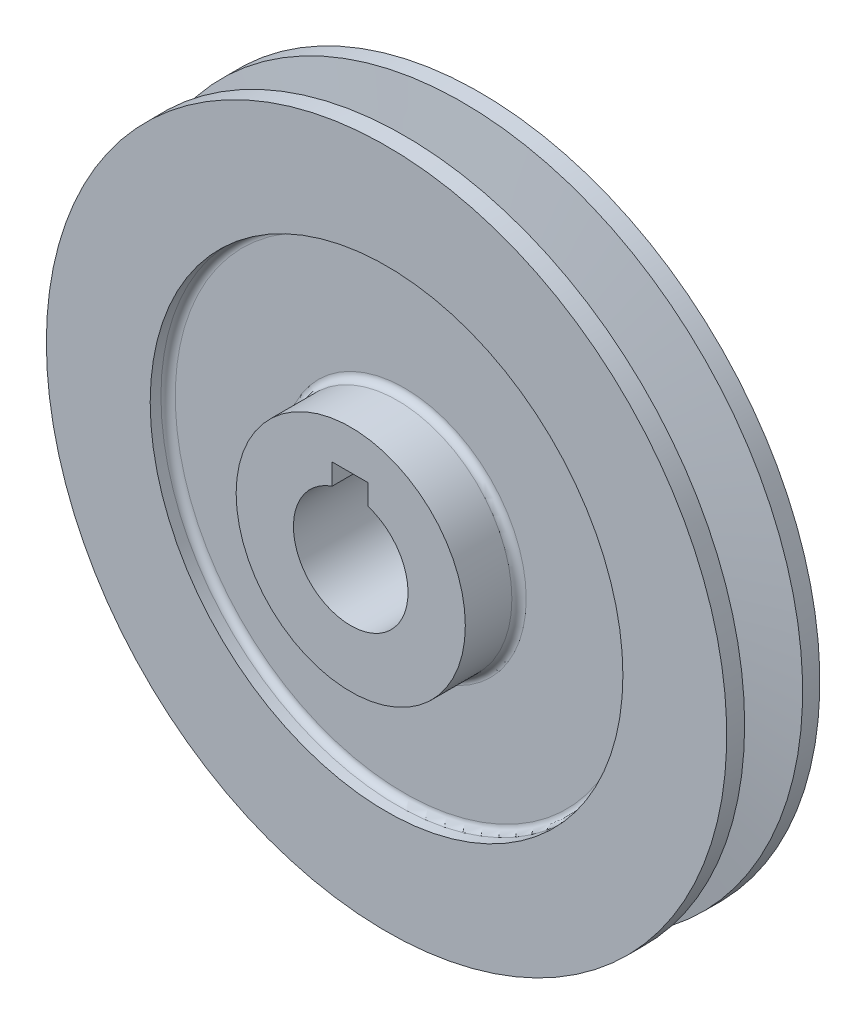
ISO-10303-21;
HEADER;
FILE_DESCRIPTION(('STEP AP214'),'2;1');
FILE_NAME('part.step','',(''),(''),'','','');
FILE_SCHEMA(('AUTOMOTIVE_DESIGN { 1 0 10303 214 1 1 1 1 }'));
ENDSEC;
DATA;
#1=APPLICATION_CONTEXT('core data for automotive mechanical design processes');
#2=APPLICATION_PROTOCOL_DEFINITION('international standard','automotive_design',2000,#1);
#3=PRODUCT_CONTEXT('',#1,'mechanical');
#4=PRODUCT('Part','Part','',(#3));
#5=PRODUCT_RELATED_PRODUCT_CATEGORY('part','',(#4));
#6=PRODUCT_DEFINITION_FORMATION('','',#4);
#7=PRODUCT_DEFINITION_CONTEXT('part definition',#1,'design');
#8=PRODUCT_DEFINITION('design','',#6,#7);
#9=PRODUCT_DEFINITION_SHAPE('','',#8);
#10=(LENGTH_UNIT() NAMED_UNIT(*) SI_UNIT(.MILLI.,.METRE.));
#11=(NAMED_UNIT(*) PLANE_ANGLE_UNIT() SI_UNIT($,.RADIAN.));
#12=(NAMED_UNIT(*) SI_UNIT($,.STERADIAN.) SOLID_ANGLE_UNIT());
#13=UNCERTAINTY_MEASURE_WITH_UNIT(LENGTH_MEASURE(1.E-05),#10,'distance_accuracy_value','');
#14=(GEOMETRIC_REPRESENTATION_CONTEXT(3) GLOBAL_UNCERTAINTY_ASSIGNED_CONTEXT((#13)) GLOBAL_UNIT_ASSIGNED_CONTEXT((#10,
#11,#12)) REPRESENTATION_CONTEXT('',''));
#15=CARTESIAN_POINT('',(0.,0.,0.));
#16=DIRECTION('',(0.,0.,1.));
#17=DIRECTION('',(1.,0.,0.));
#18=AXIS2_PLACEMENT_3D('',#15,#16,#17);
#19=CARTESIAN_POINT('',(0.,0.,13.));
#20=DIRECTION('',(0.,0.,-1.));
#21=DIRECTION('',(-1.,0.,0.));
#22=AXIS2_PLACEMENT_3D('',#19,#20,#21);
#23=CYLINDRICAL_SURFACE('',#22,47.5);
#24=CARTESIAN_POINT('',(0.,0.,0.));
#25=DIRECTION('',(0.,0.,1.));
#26=DIRECTION('',(1.,0.,0.));
#27=AXIS2_PLACEMENT_3D('',#24,#25,#26);
#28=CIRCLE('',#27,47.5);
#29=CARTESIAN_POINT('',(-47.5,0.,0.));
#30=VERTEX_POINT('',#29);
#31=EDGE_CURVE('E142',#30,#30,#28,.T.);
#32=CARTESIAN_POINT('',(0.,0.,2.40344567971953));
#33=DIRECTION('',(0.,0.,1.));
#34=DIRECTION('',(1.,0.,0.));
#35=AXIS2_PLACEMENT_3D('',#32,#33,#34);
#36=CIRCLE('',#35,47.5);
#37=CARTESIAN_POINT('',(-47.5,0.,2.40344567971953));
#38=VERTEX_POINT('',#37);
#39=EDGE_CURVE('E122',#38,#38,#36,.T.);
#40=CARTESIAN_POINT('',(-47.5,0.,0.));
#41=CARTESIAN_POINT('',(-47.5,0.,0.0250358924970782));
#42=CARTESIAN_POINT('',(-47.5,0.,0.0500717849941564));
#43=CARTESIAN_POINT('',(-47.5,0.,0.100143569988313));
#44=CARTESIAN_POINT('',(-47.5,0.,0.125179462485392));
#45=CARTESIAN_POINT('',(-47.5,0.,0.17525124747955));
#46=CARTESIAN_POINT('',(-47.5,0.,0.200287139976628));
#47=CARTESIAN_POINT('',(-47.5,0.,0.250358924970785));
#48=CARTESIAN_POINT('',(-47.5,0.,0.275394817467864));
#49=CARTESIAN_POINT('',(-47.5,0.,0.32546660246202));
#50=CARTESIAN_POINT('',(-47.5,0.,0.350502494959098));
#51=CARTESIAN_POINT('',(-47.5,0.,0.400574279953255));
#52=CARTESIAN_POINT('',(-47.5,0.,0.425610172450334));
#53=CARTESIAN_POINT('',(-47.5,0.,0.475681957444492));
#54=CARTESIAN_POINT('',(-47.5,0.,0.50071784994157));
#55=CARTESIAN_POINT('',(-47.5,0.,0.550789634935727));
#56=CARTESIAN_POINT('',(-47.5,0.,0.575825527432805));
#57=CARTESIAN_POINT('',(-47.5,0.,0.625897312426962));
#58=CARTESIAN_POINT('',(-47.5,0.,0.65093320492404));
#59=CARTESIAN_POINT('',(-47.5,0.,0.701004989918197));
#60=CARTESIAN_POINT('',(-47.5,0.,0.726040882415276));
#61=CARTESIAN_POINT('',(-47.5,0.,0.776112667409433));
#62=CARTESIAN_POINT('',(-47.5,0.,0.801148559906512));
#63=CARTESIAN_POINT('',(-47.5,0.,0.851220344900669));
#64=CARTESIAN_POINT('',(-47.5,0.,0.876256237397747));
#65=CARTESIAN_POINT('',(-47.5,0.,0.926328022391904));
#66=CARTESIAN_POINT('',(-47.5,0.,0.951363914888982));
#67=CARTESIAN_POINT('',(-47.5,0.,1.00143569988314));
#68=CARTESIAN_POINT('',(-47.5,0.,1.02647159238022));
#69=CARTESIAN_POINT('',(-47.5,0.,1.07654337737438));
#70=CARTESIAN_POINT('',(-47.5,0.,1.10157926987145));
#71=CARTESIAN_POINT('',(-47.5,0.,1.15165105486561));
#72=CARTESIAN_POINT('',(-47.5,0.,1.17668694736269));
#73=CARTESIAN_POINT('',(-47.5,0.,1.22675873235685));
#74=CARTESIAN_POINT('',(-47.5,0.,1.25179462485392));
#75=CARTESIAN_POINT('',(-47.5,0.,1.30186640984808));
#76=CARTESIAN_POINT('',(-47.5,0.,1.32690230234516));
#77=CARTESIAN_POINT('',(-47.5,0.,1.37697408733932));
#78=CARTESIAN_POINT('',(-47.5,0.,1.4020099798364));
#79=CARTESIAN_POINT('',(-47.5,0.,1.45208176483055));
#80=CARTESIAN_POINT('',(-47.5,0.,1.47711765732763));
#81=CARTESIAN_POINT('',(-47.5,0.,1.52718944232179));
#82=CARTESIAN_POINT('',(-47.5,0.,1.55222533481887));
#83=CARTESIAN_POINT('',(-47.5,0.,1.60229711981302));
#84=CARTESIAN_POINT('',(-47.5,0.,1.6273330123101));
#85=CARTESIAN_POINT('',(-47.5,0.,1.67740479730426));
#86=CARTESIAN_POINT('',(-47.5,0.,1.70244068980134));
#87=CARTESIAN_POINT('',(-47.5,0.,1.75251247479549));
#88=CARTESIAN_POINT('',(-47.5,0.,1.77754836729257));
#89=CARTESIAN_POINT('',(-47.5,0.,1.82762015228673));
#90=CARTESIAN_POINT('',(-47.5,0.,1.85265604478381));
#91=CARTESIAN_POINT('',(-47.5,0.,1.90272782977796));
#92=CARTESIAN_POINT('',(-47.5,0.,1.92776372227504));
#93=CARTESIAN_POINT('',(-47.5,0.,1.9778355072692));
#94=CARTESIAN_POINT('',(-47.5,0.,2.00287139976628));
#95=CARTESIAN_POINT('',(-47.5,0.,2.05294318476044));
#96=CARTESIAN_POINT('',(-47.5,0.,2.07797907725751));
#97=CARTESIAN_POINT('',(-47.5,0.,2.12805086225167));
#98=CARTESIAN_POINT('',(-47.5,0.,2.15308675474875));
#99=CARTESIAN_POINT('',(-47.5,0.,2.20315853974291));
#100=CARTESIAN_POINT('',(-47.5,0.,2.22819443223998));
#101=CARTESIAN_POINT('',(-47.5,0.,2.27826621723414));
#102=CARTESIAN_POINT('',(-47.5,0.,2.30330210973122));
#103=CARTESIAN_POINT('',(-47.5,0.,2.35337389472538));
#104=CARTESIAN_POINT('',(-47.5,0.,2.37840978722246));
#105=CARTESIAN_POINT('',(-47.5,0.,2.40344567971953));
#106=B_SPLINE_CURVE_WITH_KNOTS('',3,(#40,#41,#42,#43,#44,#45,#46,#47,#48,#49,#50,#51,#52,#53,
#54,#55,#56,#57,#58,#59,#60,#61,#62,#63,#64,#65,#66,#67,#68,#69,#70,#71,#72,#73,#74,#75,#76,#77,
#78,#79,#80,#81,#82,#83,#84,#85,#86,#87,#88,#89,#90,#91,#92,#93,#94,#95,#96,#97,#98,#99,#100,
#101,#102,#103,#104,#105),.UNSPECIFIED.,.F.,.F.,(4,2,2,2,2,2,2,2,2,2,2,2,2,2,2,2,2,2,2,2,2,2,2,
2,2,2,2,2,2,2,2,2,4),(0.,0.0751076774912346,0.150215354982471,0.225323032473707,
0.300430709964942,0.375538387456176,0.450646064947413,0.525753742438649,0.600861419929884,
0.675969097421118,0.751076774912355,0.826184452403591,0.901292129894826,0.97639980738606,
1.0515074848773,1.12661516236853,1.20172283985977,1.276830517351,1.35193819484224,
1.42704587233347,1.50215354982471,1.57726122731594,1.65236890480718,1.72747658229842,
1.80258425978965,1.87769193728089,1.95279961477212,2.02790729226336,2.10301496975459,
2.17812264724583,2.25323032473706,2.3283380022283,2.40344567971953),.UNSPECIFIED.);
#107=EDGE_CURVE('BSEAM47',#30,#38,#106,.T.);
#108=ORIENTED_EDGE('',*,*,#31,.T.);
#109=ORIENTED_EDGE('',*,*,#39,.F.);
#110=ORIENTED_EDGE('',*,*,#107,.T.);
#111=ORIENTED_EDGE('',*,*,#107,.F.);
#112=EDGE_LOOP('',(#108,#110,#109,#111));
#113=FACE_BOUND('',#112,.T.);
#114=ADVANCED_FACE('F47',(#113),#23,.T.);
#115=CARTESIAN_POINT('',(0.,0.,13.));
#116=DIRECTION('',(0.,0.,1.));
#117=DIRECTION('',(1.,0.,0.));
#118=AXIS2_PLACEMENT_3D('',#115,#116,#117);
#119=CIRCLE('',#118,47.5);
#120=CARTESIAN_POINT('',(-47.5,0.,13.));
#121=VERTEX_POINT('',#120);
#122=EDGE_CURVE('E143',#121,#121,#119,.T.);
#123=CARTESIAN_POINT('',(0.,0.,10.5));
#124=DIRECTION('',(0.,0.,1.));
#125=DIRECTION('',(1.,0.,0.));
#126=AXIS2_PLACEMENT_3D('',#123,#124,#125);
#127=CIRCLE('',#126,47.5);
#128=CARTESIAN_POINT('',(-47.5,0.,10.5));
#129=VERTEX_POINT('',#128);
#130=EDGE_CURVE('E109',#129,#129,#127,.T.);
#131=CARTESIAN_POINT('',(-47.5,0.,13.));
#132=CARTESIAN_POINT('',(-47.5,0.,12.9739583333333));
#133=CARTESIAN_POINT('',(-47.5,0.,12.9479166666667));
#134=CARTESIAN_POINT('',(-47.5,0.,12.8958333333333));
#135=CARTESIAN_POINT('',(-47.5,0.,12.8697916666667));
#136=CARTESIAN_POINT('',(-47.5,0.,12.8177083333333));
#137=CARTESIAN_POINT('',(-47.5,0.,12.7916666666667));
#138=CARTESIAN_POINT('',(-47.5,0.,12.7395833333333));
#139=CARTESIAN_POINT('',(-47.5,0.,12.7135416666667));
#140=CARTESIAN_POINT('',(-47.5,0.,12.6614583333333));
#141=CARTESIAN_POINT('',(-47.5,0.,12.6354166666667));
#142=CARTESIAN_POINT('',(-47.5,0.,12.5833333333333));
#143=CARTESIAN_POINT('',(-47.5,0.,12.5572916666667));
#144=CARTESIAN_POINT('',(-47.5,0.,12.5052083333333));
#145=CARTESIAN_POINT('',(-47.5,0.,12.4791666666667));
#146=CARTESIAN_POINT('',(-47.5,0.,12.4270833333333));
#147=CARTESIAN_POINT('',(-47.5,0.,12.4010416666667));
#148=CARTESIAN_POINT('',(-47.5,0.,12.3489583333333));
#149=CARTESIAN_POINT('',(-47.5,0.,12.3229166666667));
#150=CARTESIAN_POINT('',(-47.5,0.,12.2708333333333));
#151=CARTESIAN_POINT('',(-47.5,0.,12.2447916666667));
#152=CARTESIAN_POINT('',(-47.5,0.,12.1927083333333));
#153=CARTESIAN_POINT('',(-47.5,0.,12.1666666666667));
#154=CARTESIAN_POINT('',(-47.5,0.,12.1145833333333));
#155=CARTESIAN_POINT('',(-47.5,0.,12.0885416666667));
#156=CARTESIAN_POINT('',(-47.5,0.,12.0364583333333));
#157=CARTESIAN_POINT('',(-47.5,0.,12.0104166666667));
#158=CARTESIAN_POINT('',(-47.5,0.,11.9583333333333));
#159=CARTESIAN_POINT('',(-47.5,0.,11.9322916666667));
#160=CARTESIAN_POINT('',(-47.5,0.,11.8802083333333));
#161=CARTESIAN_POINT('',(-47.5,0.,11.8541666666667));
#162=CARTESIAN_POINT('',(-47.5,0.,11.8020833333333));
#163=CARTESIAN_POINT('',(-47.5,0.,11.7760416666667));
#164=CARTESIAN_POINT('',(-47.5,0.,11.7239583333333));
#165=CARTESIAN_POINT('',(-47.5,0.,11.6979166666667));
#166=CARTESIAN_POINT('',(-47.5,0.,11.6458333333333));
#167=CARTESIAN_POINT('',(-47.5,0.,11.6197916666667));
#168=CARTESIAN_POINT('',(-47.5,0.,11.5677083333333));
#169=CARTESIAN_POINT('',(-47.5,0.,11.5416666666667));
#170=CARTESIAN_POINT('',(-47.5,0.,11.4895833333333));
#171=CARTESIAN_POINT('',(-47.5,0.,11.4635416666667));
#172=CARTESIAN_POINT('',(-47.5,0.,11.4114583333333));
#173=CARTESIAN_POINT('',(-47.5,0.,11.3854166666667));
#174=CARTESIAN_POINT('',(-47.5,0.,11.3333333333333));
#175=CARTESIAN_POINT('',(-47.5,0.,11.3072916666667));
#176=CARTESIAN_POINT('',(-47.5,0.,11.2552083333333));
#177=CARTESIAN_POINT('',(-47.5,0.,11.2291666666667));
#178=CARTESIAN_POINT('',(-47.5,0.,11.1770833333333));
#179=CARTESIAN_POINT('',(-47.5,0.,11.1510416666667));
#180=CARTESIAN_POINT('',(-47.5,0.,11.0989583333333));
#181=CARTESIAN_POINT('',(-47.5,0.,11.0729166666667));
#182=CARTESIAN_POINT('',(-47.5,0.,11.0208333333333));
#183=CARTESIAN_POINT('',(-47.5,0.,10.9947916666667));
#184=CARTESIAN_POINT('',(-47.5,0.,10.9427083333333));
#185=CARTESIAN_POINT('',(-47.5,0.,10.9166666666667));
#186=CARTESIAN_POINT('',(-47.5,0.,10.8645833333333));
#187=CARTESIAN_POINT('',(-47.5,0.,10.8385416666667));
#188=CARTESIAN_POINT('',(-47.5,0.,10.7864583333333));
#189=CARTESIAN_POINT('',(-47.5,0.,10.7604166666667));
#190=CARTESIAN_POINT('',(-47.5,0.,10.7083333333333));
#191=CARTESIAN_POINT('',(-47.5,0.,10.6822916666667));
#192=CARTESIAN_POINT('',(-47.5,0.,10.6302083333333));
#193=CARTESIAN_POINT('',(-47.5,0.,10.6041666666667));
#194=CARTESIAN_POINT('',(-47.5,0.,10.5520833333333));
#195=CARTESIAN_POINT('',(-47.5,0.,10.5260416666667));
#196=CARTESIAN_POINT('',(-47.5,0.,10.5));
#197=B_SPLINE_CURVE_WITH_KNOTS('',3,(#131,#132,#133,#134,#135,#136,#137,#138,#139,#140,#141,
#142,#143,#144,#145,#146,#147,#148,#149,#150,#151,#152,#153,#154,#155,#156,#157,#158,#159,#160,
#161,#162,#163,#164,#165,#166,#167,#168,#169,#170,#171,#172,#173,#174,#175,#176,#177,#178,#179,
#180,#181,#182,#183,#184,#185,#186,#187,#188,#189,#190,#191,#192,#193,#194,#195,#196),
.UNSPECIFIED.,.F.,.F.,(4,2,2,2,2,2,2,2,2,2,2,2,2,2,2,2,2,2,2,2,2,2,2,2,2,2,2,2,2,2,2,2,4),(0.,
0.0781249999999983,0.156249999999998,0.234374999999998,0.312499999999999,0.390624999999999,
0.468749999999999,0.546874999999999,0.624999999999999,0.703124999999999,0.781249999999999,
0.859374999999999,0.937499999999999,1.015625,1.09375,1.171875,1.25,1.328125,1.40625,1.484375,
1.5625,1.640625,1.71875,1.796875,1.875,1.953125,2.03125,2.109375,2.1875,2.265625,2.34375,
2.421875,2.5),.UNSPECIFIED.);
#198=EDGE_CURVE('BSEAM185',#121,#129,#197,.T.);
#199=ORIENTED_EDGE('',*,*,#122,.F.);
#200=ORIENTED_EDGE('',*,*,#130,.T.);
#201=ORIENTED_EDGE('',*,*,#198,.T.);
#202=ORIENTED_EDGE('',*,*,#198,.F.);
#203=EDGE_LOOP('',(#199,#201,#200,#202));
#204=FACE_BOUND('',#203,.T.);
#205=ADVANCED_FACE('F185',(#204),#23,.T.);
#206=CARTESIAN_POINT('',(0.,0.,13.));
#207=DIRECTION('',(0.,0.,1.));
#208=DIRECTION('',(1.,0.,0.));
#209=AXIS2_PLACEMENT_3D('',#206,#207,#208);
#210=PLANE('',#209);
#211=CARTESIAN_POINT('',(0.,0.,13.));
#212=DIRECTION('',(0.,0.,1.));
#213=DIRECTION('',(1.,0.,0.));
#214=AXIS2_PLACEMENT_3D('',#211,#212,#213);
#215=CIRCLE('',#214,33.);
#216=CARTESIAN_POINT('',(33.,0.,13.));
#217=VERTEX_POINT('',#216);
#218=EDGE_CURVE('E139',#217,#217,#215,.T.);
#219=ORIENTED_EDGE('',*,*,#218,.F.);
#220=EDGE_LOOP('',(#219));
#221=FACE_BOUND('',#220,.T.);
#222=ORIENTED_EDGE('',*,*,#122,.T.);
#223=EDGE_LOOP('',(#222));
#224=FACE_BOUND('',#223,.T.);
#225=ADVANCED_FACE('F192',(#221,#224),#210,.T.);
#226=CARTESIAN_POINT('',(0.,0.,0.));
#227=DIRECTION('',(0.,0.,1.));
#228=DIRECTION('',(1.,0.,0.));
#229=AXIS2_PLACEMENT_3D('',#226,#227,#228);
#230=PLANE('',#229);
#231=CARTESIAN_POINT('',(0.,0.,0.));
#232=DIRECTION('',(0.,0.,-1.));
#233=DIRECTION('',(-1.,0.,0.));
#234=AXIS2_PLACEMENT_3D('',#231,#232,#233);
#235=CIRCLE('',#234,33.);
#236=CARTESIAN_POINT('',(-33.,0.,0.));
#237=VERTEX_POINT('',#236);
#238=EDGE_CURVE('E136',#237,#237,#235,.T.);
#239=ORIENTED_EDGE('',*,*,#238,.F.);
#240=EDGE_LOOP('',(#239));
#241=FACE_BOUND('',#240,.T.);
#242=ORIENTED_EDGE('',*,*,#31,.F.);
#243=EDGE_LOOP('',(#242));
#244=FACE_BOUND('',#243,.T.);
#245=ADVANCED_FACE('F197',(#241,#244),#230,.F.);
#246=CARTESIAN_POINT('',(0.,0.,10.5));
#247=DIRECTION('',(0.,0.,1.));
#248=DIRECTION('',(1.,0.,0.));
#249=AXIS2_PLACEMENT_3D('',#246,#247,#248);
#250=CYLINDRICAL_SURFACE('',#249,33.);
#251=CARTESIAN_POINT('',(0.,0.,11.5));
#252=DIRECTION('',(0.,0.,1.));
#253=DIRECTION('',(1.,0.,0.));
#254=AXIS2_PLACEMENT_3D('',#251,#252,#253);
#255=CIRCLE('',#254,33.);
#256=CARTESIAN_POINT('',(33.,0.,11.5));
#257=VERTEX_POINT('',#256);
#258=EDGE_CURVE('E11',#257,#257,#255,.F.);
#259=ORIENTED_EDGE('',*,*,#258,.T.);
#260=EDGE_LOOP('',(#259));
#261=FACE_BOUND('',#260,.T.);
#262=ORIENTED_EDGE('',*,*,#218,.T.);
#263=EDGE_LOOP('',(#262));
#264=FACE_BOUND('',#263,.T.);
#265=ADVANCED_FACE('F249',(#261,#264),#250,.F.);
#266=CARTESIAN_POINT('',(0.,0.,10.5));
#267=DIRECTION('',(0.,0.,1.));
#268=DIRECTION('',(1.,0.,0.));
#269=AXIS2_PLACEMENT_3D('',#266,#267,#268);
#270=PLANE('',#269);
#271=CARTESIAN_POINT('',(0.,0.,10.5));
#272=DIRECTION('',(0.,0.,1.));
#273=DIRECTION('',(1.,0.,0.));
#274=AXIS2_PLACEMENT_3D('',#271,#272,#273);
#275=CIRCLE('',#274,32.);
#276=CARTESIAN_POINT('',(32.,0.,10.5));
#277=VERTEX_POINT('',#276);
#278=EDGE_CURVE('E55',#277,#277,#275,.T.);
#279=ORIENTED_EDGE('',*,*,#278,.T.);
#280=EDGE_LOOP('',(#279));
#281=FACE_BOUND('',#280,.T.);
#282=CARTESIAN_POINT('',(0.,0.,10.5));
#283=DIRECTION('',(0.,0.,1.));
#284=DIRECTION('',(1.,0.,0.));
#285=AXIS2_PLACEMENT_3D('',#282,#283,#284);
#286=CIRCLE('',#285,17.);
#287=CARTESIAN_POINT('',(17.,0.,10.5));
#288=VERTEX_POINT('',#287);
#289=EDGE_CURVE('E157',#288,#288,#286,.F.);
#290=ORIENTED_EDGE('',*,*,#289,.T.);
#291=EDGE_LOOP('',(#290));
#292=FACE_BOUND('',#291,.T.);
#293=ADVANCED_FACE('F172',(#281,#292),#270,.T.);
#294=CARTESIAN_POINT('',(0.,0.,2.5));
#295=DIRECTION('',(0.,0.,-1.));
#296=DIRECTION('',(-1.,0.,0.));
#297=AXIS2_PLACEMENT_3D('',#294,#295,#296);
#298=CYLINDRICAL_SURFACE('',#297,33.);
#299=CARTESIAN_POINT('',(0.,0.,1.5));
#300=DIRECTION('',(0.,0.,-1.));
#301=DIRECTION('',(-1.,0.,0.));
#302=AXIS2_PLACEMENT_3D('',#299,#300,#301);
#303=CIRCLE('',#302,33.);
#304=CARTESIAN_POINT('',(-33.,0.,1.5));
#305=VERTEX_POINT('',#304);
#306=EDGE_CURVE('E167',#305,#305,#303,.F.);
#307=ORIENTED_EDGE('',*,*,#306,.T.);
#308=EDGE_LOOP('',(#307));
#309=FACE_BOUND('',#308,.T.);
#310=ORIENTED_EDGE('',*,*,#238,.T.);
#311=EDGE_LOOP('',(#310));
#312=FACE_BOUND('',#311,.T.);
#313=ADVANCED_FACE('F243',(#309,#312),#298,.F.);
#314=CARTESIAN_POINT('',(0.,0.,2.5));
#315=DIRECTION('',(0.,0.,-1.));
#316=DIRECTION('',(-1.,0.,0.));
#317=AXIS2_PLACEMENT_3D('',#314,#315,#316);
#318=PLANE('',#317);
#319=CARTESIAN_POINT('',(0.,0.,2.5));
#320=DIRECTION('',(0.,0.,-1.));
#321=DIRECTION('',(-1.,0.,0.));
#322=AXIS2_PLACEMENT_3D('',#319,#320,#321);
#323=CIRCLE('',#322,32.);
#324=CARTESIAN_POINT('',(-32.,0.,2.5));
#325=VERTEX_POINT('',#324);
#326=EDGE_CURVE('E164',#325,#325,#323,.T.);
#327=ORIENTED_EDGE('',*,*,#326,.T.);
#328=EDGE_LOOP('',(#327));
#329=FACE_BOUND('',#328,.T.);
#330=CARTESIAN_POINT('',(0.,0.,2.5));
#331=DIRECTION('',(0.,0.,-1.));
#332=DIRECTION('',(-1.,0.,0.));
#333=AXIS2_PLACEMENT_3D('',#330,#331,#332);
#334=CIRCLE('',#333,17.);
#335=CARTESIAN_POINT('',(-17.,0.,2.5));
#336=VERTEX_POINT('',#335);
#337=EDGE_CURVE('E151',#336,#336,#334,.F.);
#338=ORIENTED_EDGE('',*,*,#337,.T.);
#339=EDGE_LOOP('',(#338));
#340=FACE_BOUND('',#339,.T.);
#341=ADVANCED_FACE('F239',(#329,#340),#318,.T.);
#342=CARTESIAN_POINT('',(0.,0.,-5.));
#343=DIRECTION('',(0.,0.,1.));
#344=DIRECTION('',(1.,0.,0.));
#345=AXIS2_PLACEMENT_3D('',#342,#343,#344);
#346=CYLINDRICAL_SURFACE('',#345,16.);
#347=CARTESIAN_POINT('',(0.,0.,1.5));
#348=DIRECTION('',(0.,0.,-1.));
#349=DIRECTION('',(-1.,0.,0.));
#350=AXIS2_PLACEMENT_3D('',#347,#348,#349);
#351=CIRCLE('',#350,16.);
#352=CARTESIAN_POINT('',(-16.,0.,1.5));
#353=VERTEX_POINT('',#352);
#354=EDGE_CURVE('E146',#353,#353,#351,.T.);
#355=ORIENTED_EDGE('',*,*,#354,.T.);
#356=EDGE_LOOP('',(#355));
#357=FACE_BOUND('',#356,.T.);
#358=CARTESIAN_POINT('',(0.,0.,-5.));
#359=DIRECTION('',(0.,0.,-1.));
#360=DIRECTION('',(-1.,0.,0.));
#361=AXIS2_PLACEMENT_3D('',#358,#359,#360);
#362=CIRCLE('',#361,16.);
#363=CARTESIAN_POINT('',(-16.,0.,-5.));
#364=VERTEX_POINT('',#363);
#365=EDGE_CURVE('E133',#364,#364,#362,.T.);
#366=ORIENTED_EDGE('',*,*,#365,.F.);
#367=EDGE_LOOP('',(#366));
#368=FACE_BOUND('',#367,.T.);
#369=ADVANCED_FACE('F236',(#357,#368),#346,.T.);
#370=CARTESIAN_POINT('',(0.,0.,-5.));
#371=DIRECTION('',(0.,0.,-1.));
#372=DIRECTION('',(-1.,0.,0.));
#373=AXIS2_PLACEMENT_3D('',#370,#371,#372);
#374=PLANE('',#373);
#375=DIRECTION('',(0.,-1.,0.));
#376=VECTOR('',#375,1.);
#377=CARTESIAN_POINT('',(2.40686591643139,0.,-5.));
#378=LINE('',#377,#376);
#379=CARTESIAN_POINT('',(2.40686591643139,10.5,-5.));
#380=VERTEX_POINT('',#379);
#381=CARTESIAN_POINT('',(2.40686591643139,7.62935098552432,-5.));
#382=VERTEX_POINT('',#381);
#383=EDGE_CURVE('E70',#380,#382,#378,.T.);
#384=ORIENTED_EDGE('',*,*,#383,.F.);
#385=DIRECTION('',(1.,0.,0.));
#386=VECTOR('',#385,1.);
#387=CARTESIAN_POINT('',(0.,10.5,-5.));
#388=LINE('',#387,#386);
#389=CARTESIAN_POINT('',(-2.59313408356861,10.5,-5.));
#390=VERTEX_POINT('',#389);
#391=EDGE_CURVE('E102',#390,#380,#388,.T.);
#392=ORIENTED_EDGE('',*,*,#391,.F.);
#393=DIRECTION('',(0.,1.,0.));
#394=VECTOR('',#393,1.);
#395=CARTESIAN_POINT('',(-2.59313408356861,0.,-5.));
#396=LINE('',#395,#394);
#397=CARTESIAN_POINT('',(-2.59313408356861,7.56806815671178,-5.));
#398=VERTEX_POINT('',#397);
#399=EDGE_CURVE('E88',#398,#390,#396,.T.);
#400=ORIENTED_EDGE('',*,*,#399,.F.);
#401=CARTESIAN_POINT('',(0.,0.,-5.));
#402=DIRECTION('',(0.,0.,-1.));
#403=DIRECTION('',(-1.,0.,0.));
#404=AXIS2_PLACEMENT_3D('',#401,#402,#403);
#405=CIRCLE('',#404,8.);
#406=EDGE_CURVE('E125',#382,#398,#405,.T.);
#407=ORIENTED_EDGE('',*,*,#406,.F.);
#408=EDGE_LOOP('',(#384,#392,#400,#407));
#409=FACE_BOUND('',#408,.T.);
#410=ORIENTED_EDGE('',*,*,#365,.T.);
#411=EDGE_LOOP('',(#410));
#412=FACE_BOUND('',#411,.T.);
#413=ADVANCED_FACE('F107',(#409,#412),#374,.T.);
#414=CARTESIAN_POINT('',(0.,0.,18.));
#415=DIRECTION('',(0.,0.,-1.));
#416=DIRECTION('',(-1.,0.,0.));
#417=AXIS2_PLACEMENT_3D('',#414,#415,#416);
#418=CYLINDRICAL_SURFACE('',#417,16.);
#419=CARTESIAN_POINT('',(0.,0.,11.5));
#420=DIRECTION('',(0.,0.,1.));
#421=DIRECTION('',(1.,0.,0.));
#422=AXIS2_PLACEMENT_3D('',#419,#420,#421);
#423=CIRCLE('',#422,16.);
#424=CARTESIAN_POINT('',(16.,0.,11.5));
#425=VERTEX_POINT('',#424);
#426=EDGE_CURVE('E154',#425,#425,#423,.T.);
#427=ORIENTED_EDGE('',*,*,#426,.T.);
#428=EDGE_LOOP('',(#427));
#429=FACE_BOUND('',#428,.T.);
#430=CARTESIAN_POINT('',(0.,0.,18.));
#431=DIRECTION('',(0.,0.,1.));
#432=DIRECTION('',(1.,0.,0.));
#433=AXIS2_PLACEMENT_3D('',#430,#431,#432);
#434=CIRCLE('',#433,16.);
#435=CARTESIAN_POINT('',(16.,0.,18.));
#436=VERTEX_POINT('',#435);
#437=EDGE_CURVE('E129',#436,#436,#434,.T.);
#438=ORIENTED_EDGE('',*,*,#437,.F.);
#439=EDGE_LOOP('',(#438));
#440=FACE_BOUND('',#439,.T.);
#441=ADVANCED_FACE('F218',(#429,#440),#418,.T.);
#442=CARTESIAN_POINT('',(0.,0.,18.));
#443=DIRECTION('',(0.,0.,1.));
#444=DIRECTION('',(1.,0.,0.));
#445=AXIS2_PLACEMENT_3D('',#442,#443,#444);
#446=PLANE('',#445);
#447=DIRECTION('',(0.,1.,0.));
#448=VECTOR('',#447,1.);
#449=CARTESIAN_POINT('',(2.40686591643139,0.,18.));
#450=LINE('',#449,#448);
#451=CARTESIAN_POINT('',(2.40686591643139,7.62935098552432,18.));
#452=VERTEX_POINT('',#451);
#453=CARTESIAN_POINT('',(2.40686591643139,10.5,18.));
#454=VERTEX_POINT('',#453);
#455=EDGE_CURVE('E97',#452,#454,#450,.T.);
#456=ORIENTED_EDGE('',*,*,#455,.F.);
#457=CARTESIAN_POINT('',(0.,0.,18.));
#458=DIRECTION('',(0.,0.,-1.));
#459=DIRECTION('',(-1.,0.,0.));
#460=AXIS2_PLACEMENT_3D('',#457,#458,#459);
#461=CIRCLE('',#460,8.);
#462=CARTESIAN_POINT('',(-2.59313408356861,7.56806815671178,18.));
#463=VERTEX_POINT('',#462);
#464=EDGE_CURVE('E126',#452,#463,#461,.T.);
#465=ORIENTED_EDGE('',*,*,#464,.T.);
#466=DIRECTION('',(0.,-1.,0.));
#467=VECTOR('',#466,1.);
#468=CARTESIAN_POINT('',(-2.59313408356861,0.,18.));
#469=LINE('',#468,#467);
#470=CARTESIAN_POINT('',(-2.59313408356861,10.5,18.));
#471=VERTEX_POINT('',#470);
#472=EDGE_CURVE('E62',#471,#463,#469,.T.);
#473=ORIENTED_EDGE('',*,*,#472,.F.);
#474=DIRECTION('',(-1.,0.,0.));
#475=VECTOR('',#474,1.);
#476=CARTESIAN_POINT('',(0.,10.5,18.));
#477=LINE('',#476,#475);
#478=EDGE_CURVE('E104',#454,#471,#477,.T.);
#479=ORIENTED_EDGE('',*,*,#478,.F.);
#480=EDGE_LOOP('',(#456,#465,#473,#479));
#481=FACE_BOUND('',#480,.T.);
#482=ORIENTED_EDGE('',*,*,#437,.T.);
#483=EDGE_LOOP('',(#482));
#484=FACE_BOUND('',#483,.T.);
#485=ADVANCED_FACE('F220',(#481,#484),#446,.T.);
#486=CARTESIAN_POINT('',(0.,0.,18.));
#487=DIRECTION('',(0.,0.,-1.));
#488=DIRECTION('',(-1.,0.,0.));
#489=AXIS2_PLACEMENT_3D('',#486,#487,#488);
#490=CYLINDRICAL_SURFACE('',#489,8.);
#491=ORIENTED_EDGE('',*,*,#464,.F.);
#492=DIRECTION('',(0.,0.,-1.));
#493=VECTOR('',#492,1.);
#494=CARTESIAN_POINT('',(2.40686591643139,7.62935098552432,18.));
#495=LINE('',#494,#493);
#496=EDGE_CURVE('E161',#452,#382,#495,.T.);
#497=ORIENTED_EDGE('',*,*,#496,.T.);
#498=ORIENTED_EDGE('',*,*,#406,.T.);
#499=DIRECTION('',(0.,0.,-1.));
#500=VECTOR('',#499,1.);
#501=CARTESIAN_POINT('',(-2.59313408356861,7.56806815671178,18.));
#502=LINE('',#501,#500);
#503=EDGE_CURVE('E92',#398,#463,#502,.F.);
#504=ORIENTED_EDGE('',*,*,#503,.T.);
#505=EDGE_LOOP('',(#491,#497,#498,#504));
#506=FACE_BOUND('',#505,.T.);
#507=ADVANCED_FACE('F203',(#506),#490,.F.);
#508=CARTESIAN_POINT('',(0.,0.,1.5));
#509=DIRECTION('',(0.,0.,-1.));
#510=DIRECTION('',(-1.,0.,0.));
#511=AXIS2_PLACEMENT_3D('',#508,#509,#510);
#512=TOROIDAL_SURFACE('',#511,17.,1.);
#513=ORIENTED_EDGE('',*,*,#337,.F.);
#514=EDGE_LOOP('',(#513));
#515=FACE_BOUND('',#514,.T.);
#516=ORIENTED_EDGE('',*,*,#354,.F.);
#517=EDGE_LOOP('',(#516));
#518=FACE_BOUND('',#517,.T.);
#519=ADVANCED_FACE('F199',(#515,#518),#512,.F.);
#520=CARTESIAN_POINT('',(0.,0.,11.5));
#521=DIRECTION('',(0.,0.,1.));
#522=DIRECTION('',(1.,0.,0.));
#523=AXIS2_PLACEMENT_3D('',#520,#521,#522);
#524=TOROIDAL_SURFACE('',#523,17.,1.);
#525=ORIENTED_EDGE('',*,*,#289,.F.);
#526=EDGE_LOOP('',(#525));
#527=FACE_BOUND('',#526,.T.);
#528=ORIENTED_EDGE('',*,*,#426,.F.);
#529=EDGE_LOOP('',(#528));
#530=FACE_BOUND('',#529,.T.);
#531=ADVANCED_FACE('F202',(#527,#530),#524,.F.);
#532=CARTESIAN_POINT('',(0.,0.,4.45999186299186));
#533=DIRECTION('',(0.,0.,-1.));
#534=DIRECTION('',(-1.,0.,0.));
#535=AXIS2_PLACEMENT_3D('',#532,#533,#534);
#536=CONICAL_SURFACE('',#535,33.,1.42990526056897);
#537=ORIENTED_EDGE('',*,*,#39,.T.);
#538=EDGE_LOOP('',(#537));
#539=FACE_BOUND('',#538,.T.);
#540=CARTESIAN_POINT('',(0.,0.,4.45999186299186));
#541=DIRECTION('',(0.,0.,1.));
#542=DIRECTION('',(1.,0.,0.));
#543=AXIS2_PLACEMENT_3D('',#540,#541,#542);
#544=CIRCLE('',#543,33.);
#545=CARTESIAN_POINT('',(33.,0.,4.45999186299186));
#546=VERTEX_POINT('',#545);
#547=EDGE_CURVE('E119',#546,#546,#544,.T.);
#548=ORIENTED_EDGE('',*,*,#547,.F.);
#549=EDGE_LOOP('',(#548));
#550=FACE_BOUND('',#549,.T.);
#551=ADVANCED_FACE('F205',(#539,#550),#536,.T.);
#552=CARTESIAN_POINT('',(0.,0.,31.2441211726983));
#553=DIRECTION('',(0.,0.,1.));
#554=DIRECTION('',(1.,0.,0.));
#555=AXIS2_PLACEMENT_3D('',#552,#553,#554);
#556=CYLINDRICAL_SURFACE('',#555,33.);
#557=ORIENTED_EDGE('',*,*,#547,.T.);
#558=EDGE_LOOP('',(#557));
#559=FACE_BOUND('',#558,.T.);
#560=CARTESIAN_POINT('',(0.,0.,8.50513492722667));
#561=DIRECTION('',(0.,0.,1.));
#562=DIRECTION('',(1.,0.,0.));
#563=AXIS2_PLACEMENT_3D('',#560,#561,#562);
#564=CIRCLE('',#563,33.);
#565=CARTESIAN_POINT('',(33.,0.,8.50513492722667));
#566=VERTEX_POINT('',#565);
#567=EDGE_CURVE('E112',#566,#566,#564,.T.);
#568=ORIENTED_EDGE('',*,*,#567,.F.);
#569=EDGE_LOOP('',(#568));
#570=FACE_BOUND('',#569,.T.);
#571=ADVANCED_FACE('F211',(#559,#570),#556,.T.);
#572=CARTESIAN_POINT('',(0.,0.,10.5));
#573=DIRECTION('',(0.,0.,1.));
#574=DIRECTION('',(1.,0.,0.));
#575=AXIS2_PLACEMENT_3D('',#572,#573,#574);
#576=CONICAL_SURFACE('',#575,47.5,1.43407769045882);
#577=ORIENTED_EDGE('',*,*,#567,.T.);
#578=EDGE_LOOP('',(#577));
#579=FACE_BOUND('',#578,.T.);
#580=ORIENTED_EDGE('',*,*,#130,.F.);
#581=EDGE_LOOP('',(#580));
#582=FACE_BOUND('',#581,.T.);
#583=ADVANCED_FACE('F264',(#579,#582),#576,.T.);
#584=CARTESIAN_POINT('',(2.40686591643139,10.5,-17.));
#585=DIRECTION('',(1.,0.,0.));
#586=DIRECTION('',(0.,1.,0.));
#587=AXIS2_PLACEMENT_3D('',#584,#585,#586);
#588=PLANE('',#587);
#589=ORIENTED_EDGE('',*,*,#383,.T.);
#590=ORIENTED_EDGE('',*,*,#496,.F.);
#591=ORIENTED_EDGE('',*,*,#455,.T.);
#592=DIRECTION('',(0.,0.,1.));
#593=VECTOR('',#592,1.);
#594=CARTESIAN_POINT('',(2.40686591643139,10.5,-17.));
#595=LINE('',#594,#593);
#596=EDGE_CURVE('E105',#380,#454,#595,.T.);
#597=ORIENTED_EDGE('',*,*,#596,.F.);
#598=EDGE_LOOP('',(#589,#590,#591,#597));
#599=FACE_BOUND('',#598,.T.);
#600=ADVANCED_FACE('F266',(#599),#588,.F.);
#601=CARTESIAN_POINT('',(-2.59313408356861,10.5,-17.));
#602=DIRECTION('',(-1.,0.,0.));
#603=DIRECTION('',(0.,0.,1.));
#604=AXIS2_PLACEMENT_3D('',#601,#602,#603);
#605=PLANE('',#604);
#606=ORIENTED_EDGE('',*,*,#399,.T.);
#607=DIRECTION('',(0.,0.,1.));
#608=VECTOR('',#607,1.);
#609=CARTESIAN_POINT('',(-2.59313408356861,10.5,-17.));
#610=LINE('',#609,#608);
#611=EDGE_CURVE('E91',#390,#471,#610,.T.);
#612=ORIENTED_EDGE('',*,*,#611,.T.);
#613=ORIENTED_EDGE('',*,*,#472,.T.);
#614=ORIENTED_EDGE('',*,*,#503,.F.);
#615=EDGE_LOOP('',(#606,#612,#613,#614));
#616=FACE_BOUND('',#615,.T.);
#617=ADVANCED_FACE('F90',(#616),#605,.F.);
#618=CARTESIAN_POINT('',(-2.59313408356861,10.5,-17.));
#619=DIRECTION('',(0.,1.,0.));
#620=DIRECTION('',(0.,0.,1.));
#621=AXIS2_PLACEMENT_3D('',#618,#619,#620);
#622=PLANE('',#621);
#623=ORIENTED_EDGE('',*,*,#391,.T.);
#624=ORIENTED_EDGE('',*,*,#596,.T.);
#625=ORIENTED_EDGE('',*,*,#478,.T.);
#626=ORIENTED_EDGE('',*,*,#611,.F.);
#627=EDGE_LOOP('',(#623,#624,#625,#626));
#628=FACE_BOUND('',#627,.T.);
#629=ADVANCED_FACE('F100',(#628),#622,.F.);
#630=CARTESIAN_POINT('',(0.,0.,1.5));
#631=DIRECTION('',(0.,0.,-1.));
#632=DIRECTION('',(-1.,0.,0.));
#633=AXIS2_PLACEMENT_3D('',#630,#631,#632);
#634=TOROIDAL_SURFACE('',#633,32.,1.);
#635=ORIENTED_EDGE('',*,*,#306,.F.);
#636=EDGE_LOOP('',(#635));
#637=FACE_BOUND('',#636,.T.);
#638=ORIENTED_EDGE('',*,*,#326,.F.);
#639=EDGE_LOOP('',(#638));
#640=FACE_BOUND('',#639,.T.);
#641=ADVANCED_FACE('F176',(#637,#640),#634,.F.);
#642=CARTESIAN_POINT('',(0.,0.,11.5));
#643=DIRECTION('',(0.,0.,1.));
#644=DIRECTION('',(1.,0.,0.));
#645=AXIS2_PLACEMENT_3D('',#642,#643,#644);
#646=TOROIDAL_SURFACE('',#645,32.,1.);
#647=ORIENTED_EDGE('',*,*,#258,.F.);
#648=EDGE_LOOP('',(#647));
#649=FACE_BOUND('',#648,.T.);
#650=ORIENTED_EDGE('',*,*,#278,.F.);
#651=EDGE_LOOP('',(#650));
#652=FACE_BOUND('',#651,.T.);
#653=ADVANCED_FACE('F49',(#649,#652),#646,.F.);
#654=CLOSED_SHELL('',(#114,#205,#225,#245,#265,#293,#313,#341,#369,#413,#441,#485,#507,#519,
#531,#551,#571,#583,#600,#617,#629,#641,#653));
#655=MANIFOLD_SOLID_BREP('B2',#654);
#656=ADVANCED_BREP_SHAPE_REPRESENTATION('',(#18,#655),#14);
#657=SHAPE_DEFINITION_REPRESENTATION(#9,#656);
ENDSEC;
END-ISO-10303-21;
